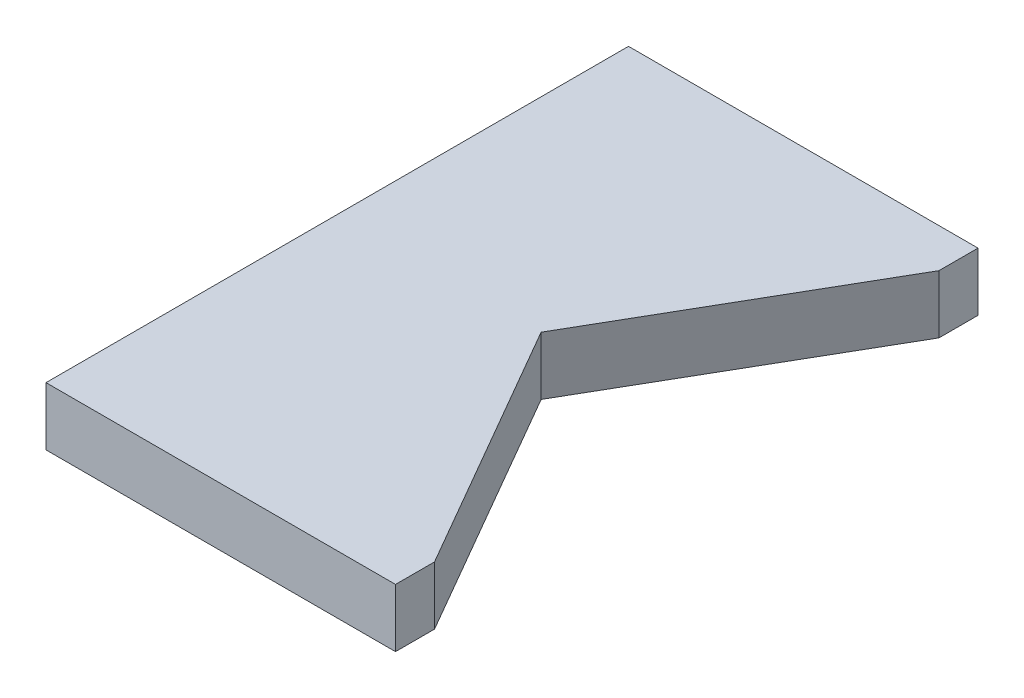
ISO-10303-21;
HEADER;
FILE_DESCRIPTION(('STEP AP214'),'2;1');
FILE_NAME('part.step','',(''),(''),'','','');
FILE_SCHEMA(('AUTOMOTIVE_DESIGN { 1 0 10303 214 1 1 1 1 }'));
ENDSEC;
DATA;
#1=APPLICATION_CONTEXT('core data for automotive mechanical design processes');
#2=APPLICATION_PROTOCOL_DEFINITION('international standard','automotive_design',2000,#1);
#3=PRODUCT_CONTEXT('',#1,'mechanical');
#4=PRODUCT('Part','Part','',(#3));
#5=PRODUCT_RELATED_PRODUCT_CATEGORY('part','',(#4));
#6=PRODUCT_DEFINITION_FORMATION('','',#4);
#7=PRODUCT_DEFINITION_CONTEXT('part definition',#1,'design');
#8=PRODUCT_DEFINITION('design','',#6,#7);
#9=PRODUCT_DEFINITION_SHAPE('','',#8);
#10=(LENGTH_UNIT() NAMED_UNIT(*) SI_UNIT(.MILLI.,.METRE.));
#11=(NAMED_UNIT(*) PLANE_ANGLE_UNIT() SI_UNIT($,.RADIAN.));
#12=(NAMED_UNIT(*) SI_UNIT($,.STERADIAN.) SOLID_ANGLE_UNIT());
#13=UNCERTAINTY_MEASURE_WITH_UNIT(LENGTH_MEASURE(1.E-05),#10,'distance_accuracy_value','');
#14=(GEOMETRIC_REPRESENTATION_CONTEXT(3) GLOBAL_UNCERTAINTY_ASSIGNED_CONTEXT((#13)) GLOBAL_UNIT_ASSIGNED_CONTEXT((#10,
#11,#12)) REPRESENTATION_CONTEXT('',''));
#15=CARTESIAN_POINT('',(0.,0.,0.));
#16=DIRECTION('',(0.,0.,1.));
#17=DIRECTION('',(1.,0.,0.));
#18=AXIS2_PLACEMENT_3D('',#15,#16,#17);
#19=CARTESIAN_POINT('',(0.,10.,-100.));
#20=DIRECTION('',(1.,0.,0.));
#21=DIRECTION('',(0.,0.,-1.));
#22=AXIS2_PLACEMENT_3D('',#19,#20,#21);
#23=PLANE('',#22);
#24=DIRECTION('',(0.,0.,1.));
#25=VECTOR('',#24,1.);
#26=CARTESIAN_POINT('',(0.,0.,-100.));
#27=LINE('',#26,#25);
#28=CARTESIAN_POINT('',(0.,0.,-100.));
#29=VERTEX_POINT('',#28);
#30=CARTESIAN_POINT('',(0.,0.,0.));
#31=VERTEX_POINT('',#30);
#32=EDGE_CURVE('E133',#29,#31,#27,.T.);
#33=ORIENTED_EDGE('',*,*,#32,.T.);
#34=DIRECTION('',(0.,-1.,0.));
#35=VECTOR('',#34,1.);
#36=CARTESIAN_POINT('',(0.,10.,0.));
#37=LINE('',#36,#35);
#38=CARTESIAN_POINT('',(0.,10.,0.));
#39=VERTEX_POINT('',#38);
#40=EDGE_CURVE('E11',#39,#31,#37,.T.);
#41=ORIENTED_EDGE('',*,*,#40,.F.);
#42=DIRECTION('',(0.,0.,1.));
#43=VECTOR('',#42,1.);
#44=CARTESIAN_POINT('',(0.,10.,-100.));
#45=LINE('',#44,#43);
#46=CARTESIAN_POINT('',(0.,10.,-100.));
#47=VERTEX_POINT('',#46);
#48=EDGE_CURVE('E144',#47,#39,#45,.T.);
#49=ORIENTED_EDGE('',*,*,#48,.F.);
#50=DIRECTION('',(0.,-1.,0.));
#51=VECTOR('',#50,1.);
#52=CARTESIAN_POINT('',(0.,10.,-100.));
#53=LINE('',#52,#51);
#54=EDGE_CURVE('E129',#47,#29,#53,.T.);
#55=ORIENTED_EDGE('',*,*,#54,.T.);
#56=EDGE_LOOP('',(#33,#41,#49,#55));
#57=FACE_BOUND('',#56,.T.);
#58=ADVANCED_FACE('F43',(#57),#23,.F.);
#59=CARTESIAN_POINT('',(0.,10.,0.));
#60=DIRECTION('',(0.,0.,-1.));
#61=DIRECTION('',(-1.,0.,0.));
#62=AXIS2_PLACEMENT_3D('',#59,#60,#61);
#63=PLANE('',#62);
#64=DIRECTION('',(1.,0.,0.));
#65=VECTOR('',#64,1.);
#66=CARTESIAN_POINT('',(0.,0.,0.));
#67=LINE('',#66,#65);
#68=CARTESIAN_POINT('',(60.,0.,0.));
#69=VERTEX_POINT('',#68);
#70=EDGE_CURVE('E136',#31,#69,#67,.T.);
#71=ORIENTED_EDGE('',*,*,#70,.T.);
#72=DIRECTION('',(0.,-1.,0.));
#73=VECTOR('',#72,1.);
#74=CARTESIAN_POINT('',(60.,10.,0.));
#75=LINE('',#74,#73);
#76=CARTESIAN_POINT('',(60.,10.,0.));
#77=VERTEX_POINT('',#76);
#78=EDGE_CURVE('E51',#77,#69,#75,.T.);
#79=ORIENTED_EDGE('',*,*,#78,.F.);
#80=DIRECTION('',(1.,0.,0.));
#81=VECTOR('',#80,1.);
#82=CARTESIAN_POINT('',(0.,10.,0.));
#83=LINE('',#82,#81);
#84=EDGE_CURVE('E98',#39,#77,#83,.T.);
#85=ORIENTED_EDGE('',*,*,#84,.F.);
#86=ORIENTED_EDGE('',*,*,#40,.T.);
#87=EDGE_LOOP('',(#71,#79,#85,#86));
#88=FACE_BOUND('',#87,.T.);
#89=ADVANCED_FACE('F169',(#88),#63,.F.);
#90=CARTESIAN_POINT('',(60.,10.,0.));
#91=DIRECTION('',(-1.,0.,0.));
#92=DIRECTION('',(0.,0.,1.));
#93=AXIS2_PLACEMENT_3D('',#90,#91,#92);
#94=PLANE('',#93);
#95=DIRECTION('',(0.,0.,-1.));
#96=VECTOR('',#95,1.);
#97=CARTESIAN_POINT('',(60.,0.,0.));
#98=LINE('',#97,#96);
#99=CARTESIAN_POINT('',(60.,0.,-6.7));
#100=VERTEX_POINT('',#99);
#101=EDGE_CURVE('E138',#69,#100,#98,.T.);
#102=ORIENTED_EDGE('',*,*,#101,.T.);
#103=DIRECTION('',(0.,-1.,0.));
#104=VECTOR('',#103,1.);
#105=CARTESIAN_POINT('',(60.,10.,-6.7));
#106=LINE('',#105,#104);
#107=CARTESIAN_POINT('',(60.,10.,-6.7));
#108=VERTEX_POINT('',#107);
#109=EDGE_CURVE('E146',#108,#100,#106,.T.);
#110=ORIENTED_EDGE('',*,*,#109,.F.);
#111=DIRECTION('',(0.,0.,-1.));
#112=VECTOR('',#111,1.);
#113=CARTESIAN_POINT('',(60.,10.,0.));
#114=LINE('',#113,#112);
#115=EDGE_CURVE('E160',#77,#108,#114,.T.);
#116=ORIENTED_EDGE('',*,*,#115,.F.);
#117=ORIENTED_EDGE('',*,*,#78,.T.);
#118=EDGE_LOOP('',(#102,#110,#116,#117));
#119=FACE_BOUND('',#118,.T.);
#120=ADVANCED_FACE('F155',(#119),#94,.F.);
#121=CARTESIAN_POINT('',(60.,10.,-6.7));
#122=DIRECTION('',(-0.866019052628739,0.,0.500011000363013));
#123=DIRECTION('',(0.500011000363013,0.,0.866019052628739));
#124=AXIS2_PLACEMENT_3D('',#121,#122,#123);
#125=PLANE('',#124);
#126=DIRECTION('',(-0.500011000363013,0.,-0.866019052628739));
#127=VECTOR('',#126,1.);
#128=CARTESIAN_POINT('',(60.,0.,-6.7));
#129=LINE('',#128,#127);
#130=CARTESIAN_POINT('',(35.,0.,-50.));
#131=VERTEX_POINT('',#130);
#132=EDGE_CURVE('E139',#100,#131,#129,.T.);
#133=ORIENTED_EDGE('',*,*,#132,.T.);
#134=DIRECTION('',(0.,-1.,0.));
#135=VECTOR('',#134,1.);
#136=CARTESIAN_POINT('',(35.,10.,-50.));
#137=LINE('',#136,#135);
#138=CARTESIAN_POINT('',(35.,10.,-50.));
#139=VERTEX_POINT('',#138);
#140=EDGE_CURVE('E125',#139,#131,#137,.T.);
#141=ORIENTED_EDGE('',*,*,#140,.F.);
#142=DIRECTION('',(-0.500011000363013,0.,-0.866019052628739));
#143=VECTOR('',#142,1.);
#144=CARTESIAN_POINT('',(60.,10.,-6.7));
#145=LINE('',#144,#143);
#146=EDGE_CURVE('E113',#108,#139,#145,.T.);
#147=ORIENTED_EDGE('',*,*,#146,.F.);
#148=ORIENTED_EDGE('',*,*,#109,.T.);
#149=EDGE_LOOP('',(#133,#141,#147,#148));
#150=FACE_BOUND('',#149,.T.);
#151=ADVANCED_FACE('F164',(#150),#125,.F.);
#152=CARTESIAN_POINT('',(35.,10.,-50.));
#153=DIRECTION('',(-0.866019052628739,0.,-0.500011000363013));
#154=DIRECTION('',(-0.500011000363013,0.,0.866019052628739));
#155=AXIS2_PLACEMENT_3D('',#152,#153,#154);
#156=PLANE('',#155);
#157=DIRECTION('',(0.500011000363013,0.,-0.866019052628739));
#158=VECTOR('',#157,1.);
#159=CARTESIAN_POINT('',(35.,0.,-50.));
#160=LINE('',#159,#158);
#161=CARTESIAN_POINT('',(60.,0.,-93.3));
#162=VERTEX_POINT('',#161);
#163=EDGE_CURVE('E121',#131,#162,#160,.T.);
#164=ORIENTED_EDGE('',*,*,#163,.T.);
#165=DIRECTION('',(0.,-1.,0.));
#166=VECTOR('',#165,1.);
#167=CARTESIAN_POINT('',(60.,10.,-93.3));
#168=LINE('',#167,#166);
#169=CARTESIAN_POINT('',(60.,10.,-93.3));
#170=VERTEX_POINT('',#169);
#171=EDGE_CURVE('E120',#170,#162,#168,.T.);
#172=ORIENTED_EDGE('',*,*,#171,.F.);
#173=DIRECTION('',(0.500011000363013,0.,-0.866019052628739));
#174=VECTOR('',#173,1.);
#175=CARTESIAN_POINT('',(35.,10.,-50.));
#176=LINE('',#175,#174);
#177=EDGE_CURVE('E108',#139,#170,#176,.T.);
#178=ORIENTED_EDGE('',*,*,#177,.F.);
#179=ORIENTED_EDGE('',*,*,#140,.T.);
#180=EDGE_LOOP('',(#164,#172,#178,#179));
#181=FACE_BOUND('',#180,.T.);
#182=ADVANCED_FACE('F123',(#181),#156,.F.);
#183=CARTESIAN_POINT('',(60.,10.,-93.3));
#184=DIRECTION('',(-1.,0.,0.));
#185=DIRECTION('',(0.,0.,1.));
#186=AXIS2_PLACEMENT_3D('',#183,#184,#185);
#187=PLANE('',#186);
#188=DIRECTION('',(0.,0.,-1.));
#189=VECTOR('',#188,1.);
#190=CARTESIAN_POINT('',(60.,0.,-93.3));
#191=LINE('',#190,#189);
#192=CARTESIAN_POINT('',(60.,0.,-100.));
#193=VERTEX_POINT('',#192);
#194=EDGE_CURVE('E82',#162,#193,#191,.T.);
#195=ORIENTED_EDGE('',*,*,#194,.T.);
#196=DIRECTION('',(0.,-1.,0.));
#197=VECTOR('',#196,1.);
#198=CARTESIAN_POINT('',(60.,10.,-100.));
#199=LINE('',#198,#197);
#200=CARTESIAN_POINT('',(60.,10.,-100.));
#201=VERTEX_POINT('',#200);
#202=EDGE_CURVE('E124',#201,#193,#199,.T.);
#203=ORIENTED_EDGE('',*,*,#202,.F.);
#204=DIRECTION('',(0.,0.,-1.));
#205=VECTOR('',#204,1.);
#206=CARTESIAN_POINT('',(60.,10.,-93.3));
#207=LINE('',#206,#205);
#208=EDGE_CURVE('E111',#170,#201,#207,.T.);
#209=ORIENTED_EDGE('',*,*,#208,.F.);
#210=ORIENTED_EDGE('',*,*,#171,.T.);
#211=EDGE_LOOP('',(#195,#203,#209,#210));
#212=FACE_BOUND('',#211,.T.);
#213=ADVANCED_FACE('F130',(#212),#187,.F.);
#214=CARTESIAN_POINT('',(60.,10.,-100.));
#215=DIRECTION('',(0.,0.,1.));
#216=DIRECTION('',(1.,0.,0.));
#217=AXIS2_PLACEMENT_3D('',#214,#215,#216);
#218=PLANE('',#217);
#219=DIRECTION('',(-1.,0.,0.));
#220=VECTOR('',#219,1.);
#221=CARTESIAN_POINT('',(60.,0.,-100.));
#222=LINE('',#221,#220);
#223=EDGE_CURVE('E91',#193,#29,#222,.T.);
#224=ORIENTED_EDGE('',*,*,#223,.T.);
#225=ORIENTED_EDGE('',*,*,#54,.F.);
#226=DIRECTION('',(-1.,0.,0.));
#227=VECTOR('',#226,1.);
#228=CARTESIAN_POINT('',(60.,10.,-100.));
#229=LINE('',#228,#227);
#230=EDGE_CURVE('E56',#201,#47,#229,.T.);
#231=ORIENTED_EDGE('',*,*,#230,.F.);
#232=ORIENTED_EDGE('',*,*,#202,.T.);
#233=EDGE_LOOP('',(#224,#225,#231,#232));
#234=FACE_BOUND('',#233,.T.);
#235=ADVANCED_FACE('F182',(#234),#218,.F.);
#236=CARTESIAN_POINT('',(0.,10.,0.));
#237=DIRECTION('',(0.,1.,0.));
#238=DIRECTION('',(0.,0.,1.));
#239=AXIS2_PLACEMENT_3D('',#236,#237,#238);
#240=PLANE('',#239);
#241=ORIENTED_EDGE('',*,*,#48,.T.);
#242=ORIENTED_EDGE('',*,*,#84,.T.);
#243=ORIENTED_EDGE('',*,*,#115,.T.);
#244=ORIENTED_EDGE('',*,*,#146,.T.);
#245=ORIENTED_EDGE('',*,*,#177,.T.);
#246=ORIENTED_EDGE('',*,*,#208,.T.);
#247=ORIENTED_EDGE('',*,*,#230,.T.);
#248=EDGE_LOOP('',(#241,#242,#243,#244,#245,#246,#247));
#249=FACE_BOUND('',#248,.T.);
#250=ADVANCED_FACE('F112',(#249),#240,.T.);
#251=CARTESIAN_POINT('',(0.,0.,0.));
#252=DIRECTION('',(0.,1.,0.));
#253=DIRECTION('',(0.,0.,1.));
#254=AXIS2_PLACEMENT_3D('',#251,#252,#253);
#255=PLANE('',#254);
#256=ORIENTED_EDGE('',*,*,#32,.F.);
#257=ORIENTED_EDGE('',*,*,#223,.F.);
#258=ORIENTED_EDGE('',*,*,#194,.F.);
#259=ORIENTED_EDGE('',*,*,#163,.F.);
#260=ORIENTED_EDGE('',*,*,#132,.F.);
#261=ORIENTED_EDGE('',*,*,#101,.F.);
#262=ORIENTED_EDGE('',*,*,#70,.F.);
#263=EDGE_LOOP('',(#256,#257,#258,#259,#260,#261,#262));
#264=FACE_BOUND('',#263,.T.);
#265=ADVANCED_FACE('F161',(#264),#255,.F.);
#266=CLOSED_SHELL('',(#58,#89,#120,#151,#182,#213,#235,#250,#265));
#267=MANIFOLD_SOLID_BREP('B2',#266);
#268=ADVANCED_BREP_SHAPE_REPRESENTATION('',(#18,#267),#14);
#269=SHAPE_DEFINITION_REPRESENTATION(#9,#268);
ENDSEC;
END-ISO-10303-21;
